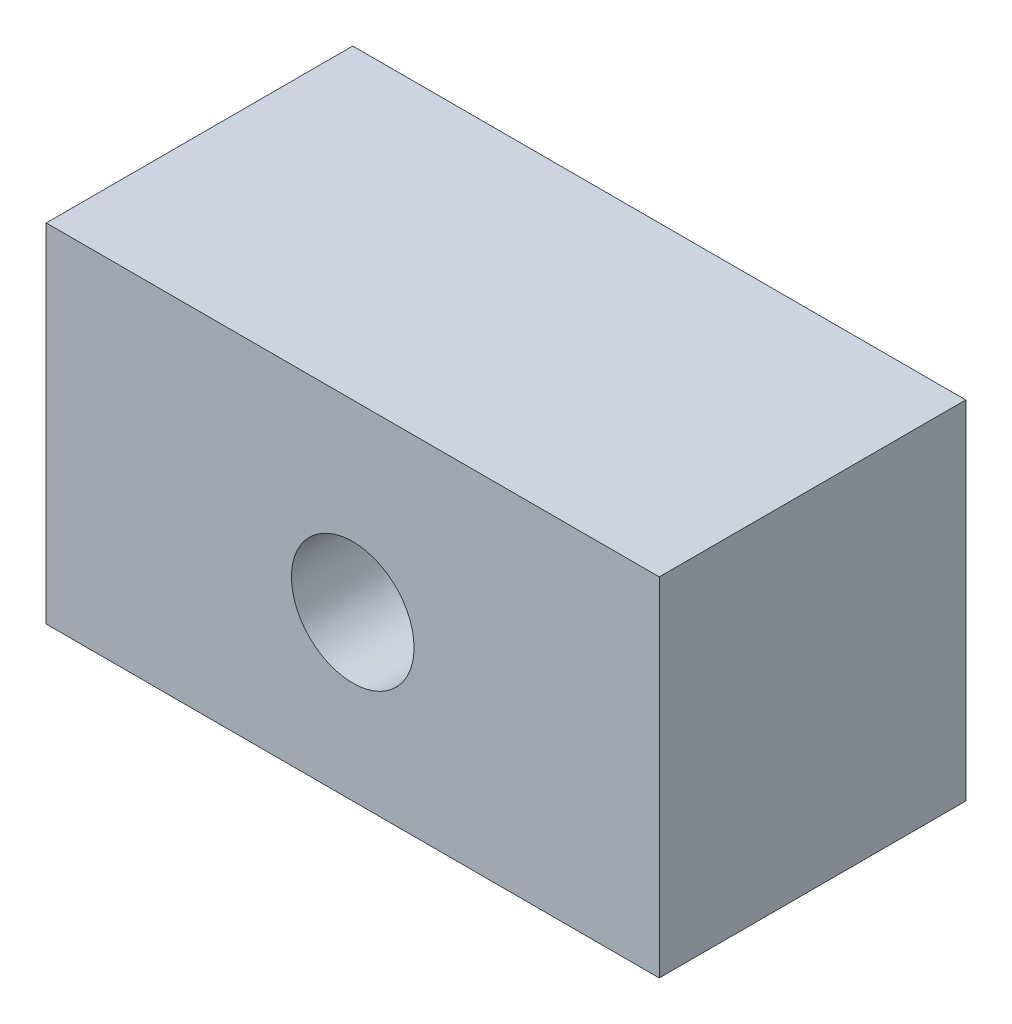
ISO-10303-21;
HEADER;
FILE_DESCRIPTION(('STEP AP214'),'2;1');
FILE_NAME('part.step','',(''),(''),'','','');
FILE_SCHEMA(('AUTOMOTIVE_DESIGN { 1 0 10303 214 1 1 1 1 }'));
ENDSEC;
DATA;
#1=APPLICATION_CONTEXT('core data for automotive mechanical design processes');
#2=APPLICATION_PROTOCOL_DEFINITION('international standard','automotive_design',2000,#1);
#3=PRODUCT_CONTEXT('',#1,'mechanical');
#4=PRODUCT('Part','Part','',(#3));
#5=PRODUCT_RELATED_PRODUCT_CATEGORY('part','',(#4));
#6=PRODUCT_DEFINITION_FORMATION('','',#4);
#7=PRODUCT_DEFINITION_CONTEXT('part definition',#1,'design');
#8=PRODUCT_DEFINITION('design','',#6,#7);
#9=PRODUCT_DEFINITION_SHAPE('','',#8);
#10=(LENGTH_UNIT() NAMED_UNIT(*) SI_UNIT(.MILLI.,.METRE.));
#11=(NAMED_UNIT(*) PLANE_ANGLE_UNIT() SI_UNIT($,.RADIAN.));
#12=(NAMED_UNIT(*) SI_UNIT($,.STERADIAN.) SOLID_ANGLE_UNIT());
#13=UNCERTAINTY_MEASURE_WITH_UNIT(LENGTH_MEASURE(1.E-05),#10,'distance_accuracy_value','');
#14=(GEOMETRIC_REPRESENTATION_CONTEXT(3) GLOBAL_UNCERTAINTY_ASSIGNED_CONTEXT((#13)) GLOBAL_UNIT_ASSIGNED_CONTEXT((#10,
#11,#12)) REPRESENTATION_CONTEXT('',''));
#15=CARTESIAN_POINT('',(0.,0.,0.));
#16=DIRECTION('',(0.,0.,1.));
#17=DIRECTION('',(1.,0.,0.));
#18=AXIS2_PLACEMENT_3D('',#15,#16,#17);
#19=CARTESIAN_POINT('',(0.,0.,0.004200000000083));
#20=DIRECTION('',(0.,0.,1.));
#21=DIRECTION('',(1.,0.,0.));
#22=AXIS2_PLACEMENT_3D('',#19,#20,#21);
#23=PLANE('',#22);
#24=CARTESIAN_POINT('',(30.,16.,0.004200000000083));
#25=DIRECTION('',(0.,0.,1.));
#26=DIRECTION('',(1.,0.,0.));
#27=AXIS2_PLACEMENT_3D('',#24,#25,#26);
#28=CIRCLE('',#27,6.);
#29=CARTESIAN_POINT('',(36.,16.,0.004200000000083));
#30=VERTEX_POINT('',#29);
#31=EDGE_CURVE('E18',#30,#30,#28,.T.);
#32=ORIENTED_EDGE('',*,*,#31,.T.);
#33=EDGE_LOOP('',(#32));
#34=FACE_BOUND('',#33,.T.);
#35=DIRECTION('',(0.,1.,0.));
#36=VECTOR('',#35,1.);
#37=CARTESIAN_POINT('',(60.,0.,0.004200000000083));
#38=LINE('',#37,#36);
#39=CARTESIAN_POINT('',(60.,0.,0.004200000000083));
#40=VERTEX_POINT('',#39);
#41=CARTESIAN_POINT('',(60.,34.,0.004200000000083));
#42=VERTEX_POINT('',#41);
#43=EDGE_CURVE('E59',#40,#42,#38,.T.);
#44=ORIENTED_EDGE('',*,*,#43,.F.);
#45=DIRECTION('',(1.,0.,0.));
#46=VECTOR('',#45,1.);
#47=CARTESIAN_POINT('',(0.,0.,0.004200000000083));
#48=LINE('',#47,#46);
#49=CARTESIAN_POINT('',(0.,0.,0.004200000000083));
#50=VERTEX_POINT('',#49);
#51=EDGE_CURVE('E53',#40,#50,#48,.F.);
#52=ORIENTED_EDGE('',*,*,#51,.T.);
#53=DIRECTION('',(0.,1.,0.));
#54=VECTOR('',#53,1.);
#55=CARTESIAN_POINT('',(0.,0.,0.004200000000083));
#56=LINE('',#55,#54);
#57=CARTESIAN_POINT('',(0.,34.,0.004200000000083));
#58=VERTEX_POINT('',#57);
#59=EDGE_CURVE('E57',#50,#58,#56,.T.);
#60=ORIENTED_EDGE('',*,*,#59,.T.);
#61=DIRECTION('',(1.,0.,0.));
#62=VECTOR('',#61,1.);
#63=CARTESIAN_POINT('',(0.,34.,0.004200000000083));
#64=LINE('',#63,#62);
#65=EDGE_CURVE('E79',#42,#58,#64,.F.);
#66=ORIENTED_EDGE('',*,*,#65,.F.);
#67=EDGE_LOOP('',(#44,#52,#60,#66));
#68=FACE_BOUND('',#67,.T.);
#69=ADVANCED_FACE('F15',(#34,#68),#23,.F.);
#70=CARTESIAN_POINT('',(0.,0.,0.004200000000083));
#71=DIRECTION('',(1.,0.,0.));
#72=DIRECTION('',(0.,0.,-1.));
#73=AXIS2_PLACEMENT_3D('',#70,#71,#72);
#74=PLANE('',#73);
#75=DIRECTION('',(0.,0.,1.));
#76=VECTOR('',#75,1.);
#77=CARTESIAN_POINT('',(0.,34.,0.004200000000083));
#78=LINE('',#77,#76);
#79=CARTESIAN_POINT('',(0.,34.,30.0042));
#80=VERTEX_POINT('',#79);
#81=EDGE_CURVE('E67',#58,#80,#78,.T.);
#82=ORIENTED_EDGE('',*,*,#81,.F.);
#83=ORIENTED_EDGE('',*,*,#59,.F.);
#84=DIRECTION('',(0.,0.,1.));
#85=VECTOR('',#84,1.);
#86=CARTESIAN_POINT('',(0.,0.,0.004200000000083));
#87=LINE('',#86,#85);
#88=CARTESIAN_POINT('',(0.,0.,30.0042));
#89=VERTEX_POINT('',#88);
#90=EDGE_CURVE('E61',#50,#89,#87,.T.);
#91=ORIENTED_EDGE('',*,*,#90,.T.);
#92=DIRECTION('',(0.,1.,0.));
#93=VECTOR('',#92,1.);
#94=CARTESIAN_POINT('',(0.,0.,30.0042));
#95=LINE('',#94,#93);
#96=EDGE_CURVE('E83',#80,#89,#95,.F.);
#97=ORIENTED_EDGE('',*,*,#96,.F.);
#98=EDGE_LOOP('',(#82,#83,#91,#97));
#99=FACE_BOUND('',#98,.T.);
#100=ADVANCED_FACE('F64',(#99),#74,.F.);
#101=CARTESIAN_POINT('',(0.,0.,0.004200000000083));
#102=DIRECTION('',(0.,1.,0.));
#103=DIRECTION('',(0.,0.,1.));
#104=AXIS2_PLACEMENT_3D('',#101,#102,#103);
#105=PLANE('',#104);
#106=DIRECTION('',(1.,0.,0.));
#107=VECTOR('',#106,1.);
#108=CARTESIAN_POINT('',(0.,0.,30.0042));
#109=LINE('',#108,#107);
#110=CARTESIAN_POINT('',(60.,0.,30.0042));
#111=VERTEX_POINT('',#110);
#112=EDGE_CURVE('E72',#89,#111,#109,.T.);
#113=ORIENTED_EDGE('',*,*,#112,.F.);
#114=ORIENTED_EDGE('',*,*,#90,.F.);
#115=ORIENTED_EDGE('',*,*,#51,.F.);
#116=DIRECTION('',(0.,0.,-1.));
#117=VECTOR('',#116,1.);
#118=CARTESIAN_POINT('',(60.,0.,0.004200000000083));
#119=LINE('',#118,#117);
#120=EDGE_CURVE('E74',#111,#40,#119,.T.);
#121=ORIENTED_EDGE('',*,*,#120,.F.);
#122=EDGE_LOOP('',(#113,#114,#115,#121));
#123=FACE_BOUND('',#122,.T.);
#124=ADVANCED_FACE('F70',(#123),#105,.F.);
#125=CARTESIAN_POINT('',(60.,0.,0.004200000000083));
#126=DIRECTION('',(1.,0.,0.));
#127=DIRECTION('',(0.,0.,-1.));
#128=AXIS2_PLACEMENT_3D('',#125,#126,#127);
#129=PLANE('',#128);
#130=DIRECTION('',(0.,0.,1.));
#131=VECTOR('',#130,1.);
#132=CARTESIAN_POINT('',(60.,34.,0.004200000000083));
#133=LINE('',#132,#131);
#134=CARTESIAN_POINT('',(60.,34.,30.0042));
#135=VERTEX_POINT('',#134);
#136=EDGE_CURVE('E32',#135,#42,#133,.F.);
#137=ORIENTED_EDGE('',*,*,#136,.F.);
#138=DIRECTION('',(0.,1.,0.));
#139=VECTOR('',#138,1.);
#140=CARTESIAN_POINT('',(60.,0.,30.0042));
#141=LINE('',#140,#139);
#142=EDGE_CURVE('E86',#111,#135,#141,.T.);
#143=ORIENTED_EDGE('',*,*,#142,.F.);
#144=ORIENTED_EDGE('',*,*,#120,.T.);
#145=ORIENTED_EDGE('',*,*,#43,.T.);
#146=EDGE_LOOP('',(#137,#143,#144,#145));
#147=FACE_BOUND('',#146,.T.);
#148=ADVANCED_FACE('F94',(#147),#129,.T.);
#149=CARTESIAN_POINT('',(0.,34.,0.004200000000083));
#150=DIRECTION('',(0.,1.,0.));
#151=DIRECTION('',(0.,0.,1.));
#152=AXIS2_PLACEMENT_3D('',#149,#150,#151);
#153=PLANE('',#152);
#154=DIRECTION('',(1.,0.,0.));
#155=VECTOR('',#154,1.);
#156=CARTESIAN_POINT('',(0.,34.,30.0042));
#157=LINE('',#156,#155);
#158=EDGE_CURVE('E24',#135,#80,#157,.F.);
#159=ORIENTED_EDGE('',*,*,#158,.F.);
#160=ORIENTED_EDGE('',*,*,#136,.T.);
#161=ORIENTED_EDGE('',*,*,#65,.T.);
#162=ORIENTED_EDGE('',*,*,#81,.T.);
#163=EDGE_LOOP('',(#159,#160,#161,#162));
#164=FACE_BOUND('',#163,.T.);
#165=ADVANCED_FACE('F93',(#164),#153,.T.);
#166=CARTESIAN_POINT('',(30.,16.,0.004200000000083));
#167=DIRECTION('',(0.,0.,1.));
#168=DIRECTION('',(1.,0.,0.));
#169=AXIS2_PLACEMENT_3D('',#166,#167,#168);
#170=CYLINDRICAL_SURFACE('',#169,6.);
#171=ORIENTED_EDGE('',*,*,#31,.F.);
#172=EDGE_LOOP('',(#171));
#173=FACE_BOUND('',#172,.T.);
#174=CARTESIAN_POINT('',(30.,16.,30.0042));
#175=DIRECTION('',(0.,0.,1.));
#176=DIRECTION('',(1.,0.,0.));
#177=AXIS2_PLACEMENT_3D('',#174,#175,#176);
#178=CIRCLE('',#177,6.);
#179=CARTESIAN_POINT('',(36.,16.,30.0042));
#180=VERTEX_POINT('',#179);
#181=EDGE_CURVE('E9',#180,#180,#178,.F.);
#182=ORIENTED_EDGE('',*,*,#181,.F.);
#183=EDGE_LOOP('',(#182));
#184=FACE_BOUND('',#183,.T.);
#185=ADVANCED_FACE('F102',(#173,#184),#170,.F.);
#186=CARTESIAN_POINT('',(0.,0.,30.0042));
#187=DIRECTION('',(0.,0.,1.));
#188=DIRECTION('',(1.,0.,0.));
#189=AXIS2_PLACEMENT_3D('',#186,#187,#188);
#190=PLANE('',#189);
#191=ORIENTED_EDGE('',*,*,#181,.T.);
#192=EDGE_LOOP('',(#191));
#193=FACE_BOUND('',#192,.T.);
#194=ORIENTED_EDGE('',*,*,#142,.T.);
#195=ORIENTED_EDGE('',*,*,#158,.T.);
#196=ORIENTED_EDGE('',*,*,#96,.T.);
#197=ORIENTED_EDGE('',*,*,#112,.T.);
#198=EDGE_LOOP('',(#194,#195,#196,#197));
#199=FACE_BOUND('',#198,.T.);
#200=ADVANCED_FACE('F91',(#193,#199),#190,.T.);
#201=CLOSED_SHELL('',(#69,#100,#124,#148,#165,#185,#200));
#202=MANIFOLD_SOLID_BREP('B1',#201);
#203=ADVANCED_BREP_SHAPE_REPRESENTATION('',(#18,#202),#14);
#204=SHAPE_DEFINITION_REPRESENTATION(#9,#203);
ENDSEC;
END-ISO-10303-21;
